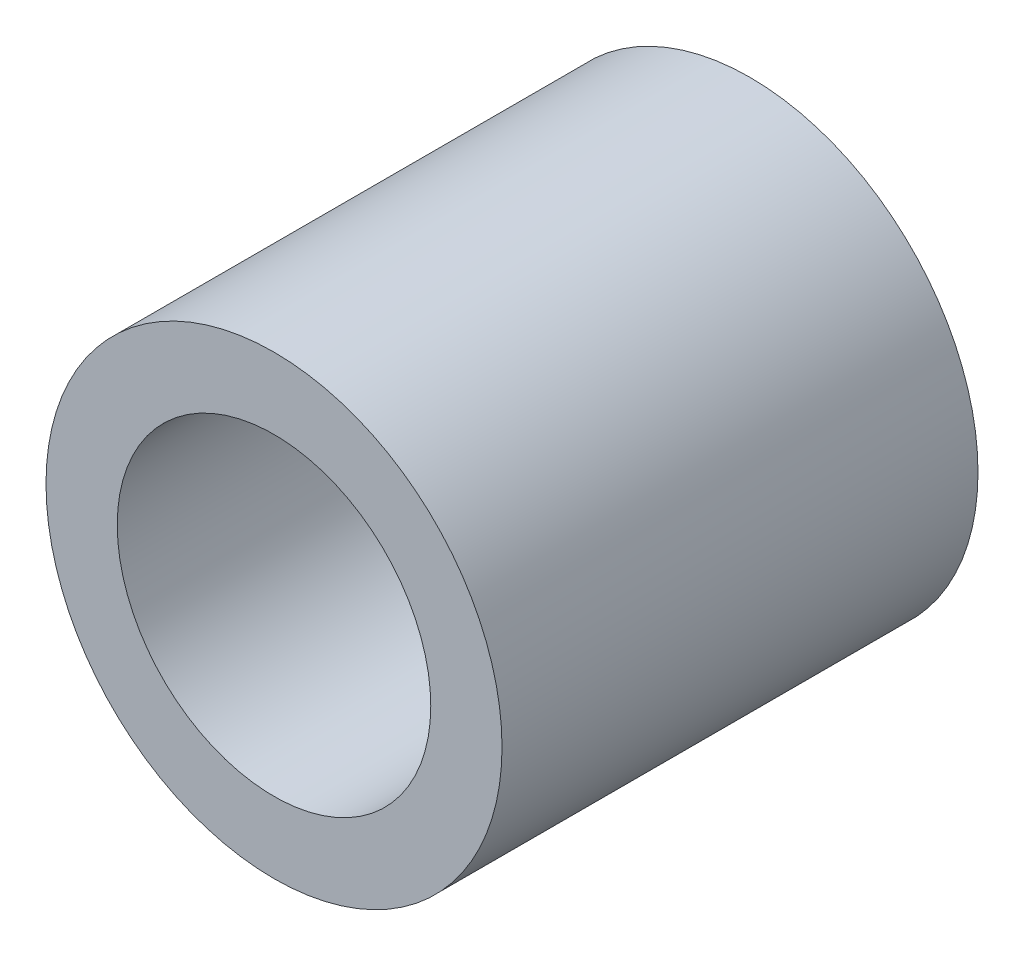
ISO-10303-21;
HEADER;
FILE_DESCRIPTION(('STEP AP214'),'2;1');
FILE_NAME('part.step','',(''),(''),'','','');
FILE_SCHEMA(('AUTOMOTIVE_DESIGN { 1 0 10303 214 1 1 1 1 }'));
ENDSEC;
DATA;
#1=APPLICATION_CONTEXT('core data for automotive mechanical design processes');
#2=APPLICATION_PROTOCOL_DEFINITION('international standard','automotive_design',2000,#1);
#3=PRODUCT_CONTEXT('',#1,'mechanical');
#4=PRODUCT('Part','Part','',(#3));
#5=PRODUCT_RELATED_PRODUCT_CATEGORY('part','',(#4));
#6=PRODUCT_DEFINITION_FORMATION('','',#4);
#7=PRODUCT_DEFINITION_CONTEXT('part definition',#1,'design');
#8=PRODUCT_DEFINITION('design','',#6,#7);
#9=PRODUCT_DEFINITION_SHAPE('','',#8);
#10=(LENGTH_UNIT() NAMED_UNIT(*) SI_UNIT(.MILLI.,.METRE.));
#11=(NAMED_UNIT(*) PLANE_ANGLE_UNIT() SI_UNIT($,.RADIAN.));
#12=(NAMED_UNIT(*) SI_UNIT($,.STERADIAN.) SOLID_ANGLE_UNIT());
#13=UNCERTAINTY_MEASURE_WITH_UNIT(LENGTH_MEASURE(1.E-05),#10,'distance_accuracy_value','');
#14=(GEOMETRIC_REPRESENTATION_CONTEXT(3) GLOBAL_UNCERTAINTY_ASSIGNED_CONTEXT((#13)) GLOBAL_UNIT_ASSIGNED_CONTEXT((#10,
#11,#12)) REPRESENTATION_CONTEXT('',''));
#15=CARTESIAN_POINT('',(0.,0.,0.));
#16=DIRECTION('',(0.,0.,1.));
#17=DIRECTION('',(1.,0.,0.));
#18=AXIS2_PLACEMENT_3D('',#15,#16,#17);
#19=CARTESIAN_POINT('',(0.,0.,-8.35));
#20=DIRECTION('',(0.,0.,1.));
#21=DIRECTION('',(1.,0.,0.));
#22=AXIS2_PLACEMENT_3D('',#19,#20,#21);
#23=CYLINDRICAL_SURFACE('',#22,4.);
#24=CARTESIAN_POINT('',(0.,0.,-8.35));
#25=DIRECTION('',(0.,0.,1.));
#26=DIRECTION('',(1.,0.,0.));
#27=AXIS2_PLACEMENT_3D('',#24,#25,#26);
#28=CIRCLE('',#27,4.);
#29=CARTESIAN_POINT('',(4.,0.,-8.35));
#30=VERTEX_POINT('',#29);
#31=EDGE_CURVE('E10',#30,#30,#28,.T.);
#32=ORIENTED_EDGE('',*,*,#31,.T.);
#33=EDGE_LOOP('',(#32));
#34=FACE_BOUND('',#33,.T.);
#35=CARTESIAN_POINT('',(0.,0.,0.));
#36=DIRECTION('',(0.,0.,1.));
#37=DIRECTION('',(1.,0.,0.));
#38=AXIS2_PLACEMENT_3D('',#35,#36,#37);
#39=CIRCLE('',#38,4.);
#40=CARTESIAN_POINT('',(4.,0.,0.));
#41=VERTEX_POINT('',#40);
#42=EDGE_CURVE('E34',#41,#41,#39,.T.);
#43=ORIENTED_EDGE('',*,*,#42,.F.);
#44=EDGE_LOOP('',(#43));
#45=FACE_BOUND('',#44,.T.);
#46=ADVANCED_FACE('F31',(#34,#45),#23,.T.);
#47=CARTESIAN_POINT('',(0.,0.,-8.35));
#48=DIRECTION('',(0.,0.,1.));
#49=DIRECTION('',(1.,0.,0.));
#50=AXIS2_PLACEMENT_3D('',#47,#48,#49);
#51=PLANE('',#50);
#52=CARTESIAN_POINT('',(0.,0.,-8.35));
#53=DIRECTION('',(0.,0.,1.));
#54=DIRECTION('',(1.,0.,0.));
#55=AXIS2_PLACEMENT_3D('',#52,#53,#54);
#56=CIRCLE('',#55,2.75);
#57=CARTESIAN_POINT('',(2.75,0.,-8.35));
#58=VERTEX_POINT('',#57);
#59=EDGE_CURVE('E41',#58,#58,#56,.T.);
#60=ORIENTED_EDGE('',*,*,#59,.T.);
#61=EDGE_LOOP('',(#60));
#62=FACE_BOUND('',#61,.T.);
#63=ORIENTED_EDGE('',*,*,#31,.F.);
#64=EDGE_LOOP('',(#63));
#65=FACE_BOUND('',#64,.T.);
#66=ADVANCED_FACE('F49',(#62,#65),#51,.F.);
#67=CARTESIAN_POINT('',(0.,0.,0.));
#68=DIRECTION('',(0.,0.,1.));
#69=DIRECTION('',(1.,0.,0.));
#70=AXIS2_PLACEMENT_3D('',#67,#68,#69);
#71=PLANE('',#70);
#72=CARTESIAN_POINT('',(0.,0.,0.));
#73=DIRECTION('',(0.,0.,1.));
#74=DIRECTION('',(1.,0.,0.));
#75=AXIS2_PLACEMENT_3D('',#72,#73,#74);
#76=CIRCLE('',#75,2.75);
#77=CARTESIAN_POINT('',(2.75,0.,0.));
#78=VERTEX_POINT('',#77);
#79=EDGE_CURVE('E43',#78,#78,#76,.T.);
#80=ORIENTED_EDGE('',*,*,#79,.F.);
#81=EDGE_LOOP('',(#80));
#82=FACE_BOUND('',#81,.T.);
#83=ORIENTED_EDGE('',*,*,#42,.T.);
#84=EDGE_LOOP('',(#83));
#85=FACE_BOUND('',#84,.T.);
#86=ADVANCED_FACE('F55',(#82,#85),#71,.T.);
#87=CARTESIAN_POINT('',(0.,0.,-8.35));
#88=DIRECTION('',(0.,0.,1.));
#89=DIRECTION('',(1.,0.,0.));
#90=AXIS2_PLACEMENT_3D('',#87,#88,#89);
#91=CYLINDRICAL_SURFACE('',#90,2.75);
#92=ORIENTED_EDGE('',*,*,#59,.F.);
#93=EDGE_LOOP('',(#92));
#94=FACE_BOUND('',#93,.T.);
#95=ORIENTED_EDGE('',*,*,#79,.T.);
#96=EDGE_LOOP('',(#95));
#97=FACE_BOUND('',#96,.T.);
#98=ADVANCED_FACE('F52',(#94,#97),#91,.F.);
#99=CLOSED_SHELL('',(#46,#66,#86,#98));
#100=MANIFOLD_SOLID_BREP('B2',#99);
#101=ADVANCED_BREP_SHAPE_REPRESENTATION('',(#18,#100),#14);
#102=SHAPE_DEFINITION_REPRESENTATION(#9,#101);
ENDSEC;
END-ISO-10303-21;
